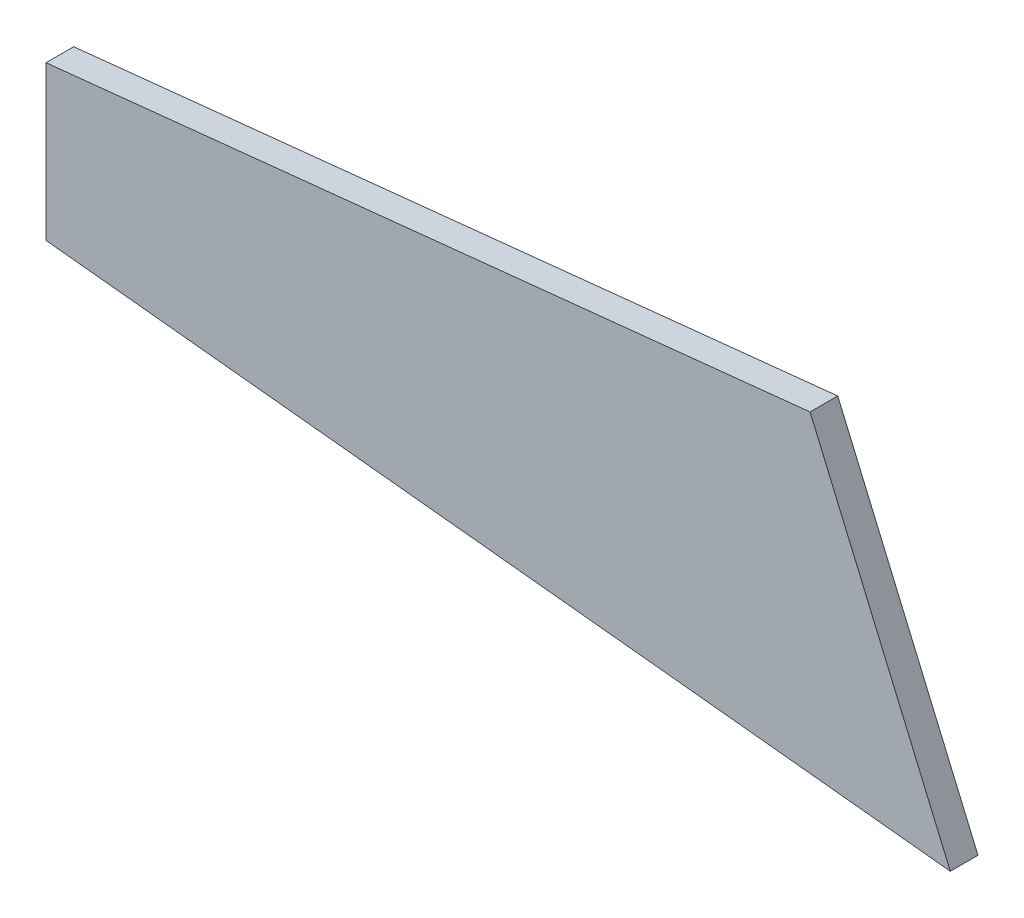
ISO-10303-21;
HEADER;
FILE_DESCRIPTION(('STEP AP214'),'2;1');
FILE_NAME('part.step','',(''),(''),'','','');
FILE_SCHEMA(('AUTOMOTIVE_DESIGN { 1 0 10303 214 1 1 1 1 }'));
ENDSEC;
DATA;
#1=APPLICATION_CONTEXT('core data for automotive mechanical design processes');
#2=APPLICATION_PROTOCOL_DEFINITION('international standard','automotive_design',2000,#1);
#3=PRODUCT_CONTEXT('',#1,'mechanical');
#4=PRODUCT('Part','Part','',(#3));
#5=PRODUCT_RELATED_PRODUCT_CATEGORY('part','',(#4));
#6=PRODUCT_DEFINITION_FORMATION('','',#4);
#7=PRODUCT_DEFINITION_CONTEXT('part definition',#1,'design');
#8=PRODUCT_DEFINITION('design','',#6,#7);
#9=PRODUCT_DEFINITION_SHAPE('','',#8);
#10=(LENGTH_UNIT() NAMED_UNIT(*) SI_UNIT(.MILLI.,.METRE.));
#11=(NAMED_UNIT(*) PLANE_ANGLE_UNIT() SI_UNIT($,.RADIAN.));
#12=(NAMED_UNIT(*) SI_UNIT($,.STERADIAN.) SOLID_ANGLE_UNIT());
#13=UNCERTAINTY_MEASURE_WITH_UNIT(LENGTH_MEASURE(1.E-05),#10,'distance_accuracy_value','');
#14=(GEOMETRIC_REPRESENTATION_CONTEXT(3) GLOBAL_UNCERTAINTY_ASSIGNED_CONTEXT((#13)) GLOBAL_UNIT_ASSIGNED_CONTEXT((#10,
#11,#12)) REPRESENTATION_CONTEXT('',''));
#15=CARTESIAN_POINT('',(0.,0.,0.));
#16=DIRECTION('',(0.,0.,1.));
#17=DIRECTION('',(1.,0.,0.));
#18=AXIS2_PLACEMENT_3D('',#15,#16,#17);
#19=CARTESIAN_POINT('',(139.99999999999,50.,2.273736754432E-13));
#20=DIRECTION('',(0.103606084258982,-0.994618408890827,0.));
#21=DIRECTION('',(0.,0.,-1.));
#22=AXIS2_PLACEMENT_3D('',#19,#20,#21);
#23=PLANE('',#22);
#24=DIRECTION('',(0.,0.,1.));
#25=VECTOR('',#24,1.);
#26=CARTESIAN_POINT('',(-180.,16.666666666667,0.));
#27=LINE('',#26,#25);
#28=CARTESIAN_POINT('',(-180.,16.666666666667,0.));
#29=VERTEX_POINT('',#28);
#30=CARTESIAN_POINT('',(-180.,16.666666666667,6.));
#31=VERTEX_POINT('',#30);
#32=EDGE_CURVE('E11',#29,#31,#27,.T.);
#33=ORIENTED_EDGE('',*,*,#32,.T.);
#34=DIRECTION('',(-0.994618408890827,-0.103606084258982,0.));
#35=VECTOR('',#34,1.);
#36=CARTESIAN_POINT('',(139.99999999999,50.,6.));
#37=LINE('',#36,#35);
#38=CARTESIAN_POINT('',(-14.51041594171,33.905165006072,6.));
#39=VERTEX_POINT('',#38);
#40=EDGE_CURVE('E20',#39,#31,#37,.T.);
#41=ORIENTED_EDGE('',*,*,#40,.F.);
#42=DIRECTION('',(0.,0.,-1.));
#43=VECTOR('',#42,1.);
#44=CARTESIAN_POINT('',(-14.51041594171,33.905165006072,-917.5));
#45=LINE('',#44,#43);
#46=CARTESIAN_POINT('',(-14.51041594171,33.905165006072,0.));
#47=VERTEX_POINT('',#46);
#48=EDGE_CURVE('E54',#39,#47,#45,.T.);
#49=ORIENTED_EDGE('',*,*,#48,.T.);
#50=DIRECTION('',(-0.994618408890827,-0.103606084258982,0.));
#51=VECTOR('',#50,1.);
#52=CARTESIAN_POINT('',(139.99999999999,50.,2.273736754432E-13));
#53=LINE('',#52,#51);
#54=EDGE_CURVE('E71',#47,#29,#53,.T.);
#55=ORIENTED_EDGE('',*,*,#54,.T.);
#56=EDGE_LOOP('',(#33,#41,#49,#55));
#57=FACE_BOUND('',#56,.T.);
#58=ADVANCED_FACE('F17',(#57),#23,.F.);
#59=CARTESIAN_POINT('',(-180.,16.666666666667,0.));
#60=DIRECTION('',(1.,0.,0.));
#61=DIRECTION('',(0.,1.,0.));
#62=AXIS2_PLACEMENT_3D('',#59,#60,#61);
#63=PLANE('',#62);
#64=DIRECTION('',(0.,-1.,0.));
#65=VECTOR('',#64,1.);
#66=CARTESIAN_POINT('',(-180.,16.666666666667,0.));
#67=LINE('',#66,#65);
#68=CARTESIAN_POINT('',(-180.,-16.66666666666,0.));
#69=VERTEX_POINT('',#68);
#70=EDGE_CURVE('E63',#29,#69,#67,.T.);
#71=ORIENTED_EDGE('',*,*,#70,.T.);
#72=DIRECTION('',(0.,0.,1.));
#73=VECTOR('',#72,1.);
#74=CARTESIAN_POINT('',(-180.,-16.66666666666,0.));
#75=LINE('',#74,#73);
#76=CARTESIAN_POINT('',(-180.,-16.66666666666,6.));
#77=VERTEX_POINT('',#76);
#78=EDGE_CURVE('E85',#69,#77,#75,.T.);
#79=ORIENTED_EDGE('',*,*,#78,.T.);
#80=DIRECTION('',(0.,-1.,0.));
#81=VECTOR('',#80,1.);
#82=CARTESIAN_POINT('',(-180.,16.666666666667,6.));
#83=LINE('',#82,#81);
#84=EDGE_CURVE('E66',#31,#77,#83,.T.);
#85=ORIENTED_EDGE('',*,*,#84,.F.);
#86=ORIENTED_EDGE('',*,*,#32,.F.);
#87=EDGE_LOOP('',(#71,#79,#85,#86));
#88=FACE_BOUND('',#87,.T.);
#89=ADVANCED_FACE('F61',(#88),#63,.F.);
#90=CARTESIAN_POINT('',(-6.268384370372,1.136868377216E-13,6.));
#91=DIRECTION('',(0.,0.,1.));
#92=DIRECTION('',(0.,-1.,0.));
#93=AXIS2_PLACEMENT_3D('',#90,#91,#92);
#94=PLANE('',#93);
#95=ORIENTED_EDGE('',*,*,#84,.T.);
#96=DIRECTION('',(0.994618408890827,-0.103606084258982,0.));
#97=VECTOR('',#96,1.);
#98=CARTESIAN_POINT('',(-180.,-16.66666666666,6.));
#99=LINE('',#98,#97);
#100=CARTESIAN_POINT('',(15.864539898482,-37.06922290609,6.));
#101=VERTEX_POINT('',#100);
#102=EDGE_CURVE('E108',#77,#101,#99,.T.);
#103=ORIENTED_EDGE('',*,*,#102,.T.);
#104=DIRECTION('',(0.393452640342015,-0.919344886214035,0.));
#105=VECTOR('',#104,1.);
#106=CARTESIAN_POINT('',(-224.2709017081,524.03335362809,6.));
#107=LINE('',#106,#105);
#108=EDGE_CURVE('E89',#39,#101,#107,.T.);
#109=ORIENTED_EDGE('',*,*,#108,.F.);
#110=ORIENTED_EDGE('',*,*,#40,.T.);
#111=EDGE_LOOP('',(#95,#103,#109,#110));
#112=FACE_BOUND('',#111,.T.);
#113=ADVANCED_FACE('F115',(#112),#94,.T.);
#114=CARTESIAN_POINT('',(-447.5714262979,1045.799315581,-1835.));
#115=DIRECTION('',(-0.919344886214035,-0.393452640342015,0.));
#116=DIRECTION('',(-0.393452640342015,0.919344886214035,0.));
#117=AXIS2_PLACEMENT_3D('',#114,#115,#116);
#118=PLANE('',#117);
#119=ORIENTED_EDGE('',*,*,#48,.F.);
#120=ORIENTED_EDGE('',*,*,#108,.T.);
#121=DIRECTION('',(0.,0.,1.));
#122=VECTOR('',#121,1.);
#123=CARTESIAN_POINT('',(15.864539898482,-37.06922290609,-917.5));
#124=LINE('',#123,#122);
#125=CARTESIAN_POINT('',(15.864539898482,-37.06922290609,2.273736754432E-13));
#126=VERTEX_POINT('',#125);
#127=EDGE_CURVE('E107',#126,#101,#124,.T.);
#128=ORIENTED_EDGE('',*,*,#127,.F.);
#129=DIRECTION('',(0.393452640342015,-0.919344886214035,0.));
#130=VECTOR('',#129,1.);
#131=CARTESIAN_POINT('',(-224.2709017081,524.03335362809,0.));
#132=LINE('',#131,#130);
#133=EDGE_CURVE('E76',#47,#126,#132,.T.);
#134=ORIENTED_EDGE('',*,*,#133,.F.);
#135=EDGE_LOOP('',(#119,#120,#128,#134));
#136=FACE_BOUND('',#135,.T.);
#137=ADVANCED_FACE('F123',(#136),#118,.F.);
#138=CARTESIAN_POINT('',(-6.268384370372,1.136868377216E-13,2.273736754432E-13));
#139=DIRECTION('',(0.,0.,1.));
#140=DIRECTION('',(0.,-1.,0.));
#141=AXIS2_PLACEMENT_3D('',#138,#139,#140);
#142=PLANE('',#141);
#143=ORIENTED_EDGE('',*,*,#54,.F.);
#144=ORIENTED_EDGE('',*,*,#133,.T.);
#145=DIRECTION('',(0.994618408890827,-0.103606084258982,0.));
#146=VECTOR('',#145,1.);
#147=CARTESIAN_POINT('',(-180.,-16.66666666666,0.));
#148=LINE('',#147,#146);
#149=EDGE_CURVE('E73',#69,#126,#148,.T.);
#150=ORIENTED_EDGE('',*,*,#149,.F.);
#151=ORIENTED_EDGE('',*,*,#70,.F.);
#152=EDGE_LOOP('',(#143,#144,#150,#151));
#153=FACE_BOUND('',#152,.T.);
#154=ADVANCED_FACE('F69',(#153),#142,.F.);
#155=CARTESIAN_POINT('',(-180.,-16.66666666666,0.));
#156=DIRECTION('',(0.103606084258982,0.994618408890827,0.));
#157=DIRECTION('',(0.,0.,-1.));
#158=AXIS2_PLACEMENT_3D('',#155,#156,#157);
#159=PLANE('',#158);
#160=ORIENTED_EDGE('',*,*,#127,.T.);
#161=ORIENTED_EDGE('',*,*,#102,.F.);
#162=ORIENTED_EDGE('',*,*,#78,.F.);
#163=ORIENTED_EDGE('',*,*,#149,.T.);
#164=EDGE_LOOP('',(#160,#161,#162,#163));
#165=FACE_BOUND('',#164,.T.);
#166=ADVANCED_FACE('F114',(#165),#159,.F.);
#167=CLOSED_SHELL('',(#58,#89,#113,#137,#154,#166));
#168=MANIFOLD_SOLID_BREP('B1',#167);
#169=ADVANCED_BREP_SHAPE_REPRESENTATION('',(#18,#168),#14);
#170=SHAPE_DEFINITION_REPRESENTATION(#9,#169);
ENDSEC;
END-ISO-10303-21;
